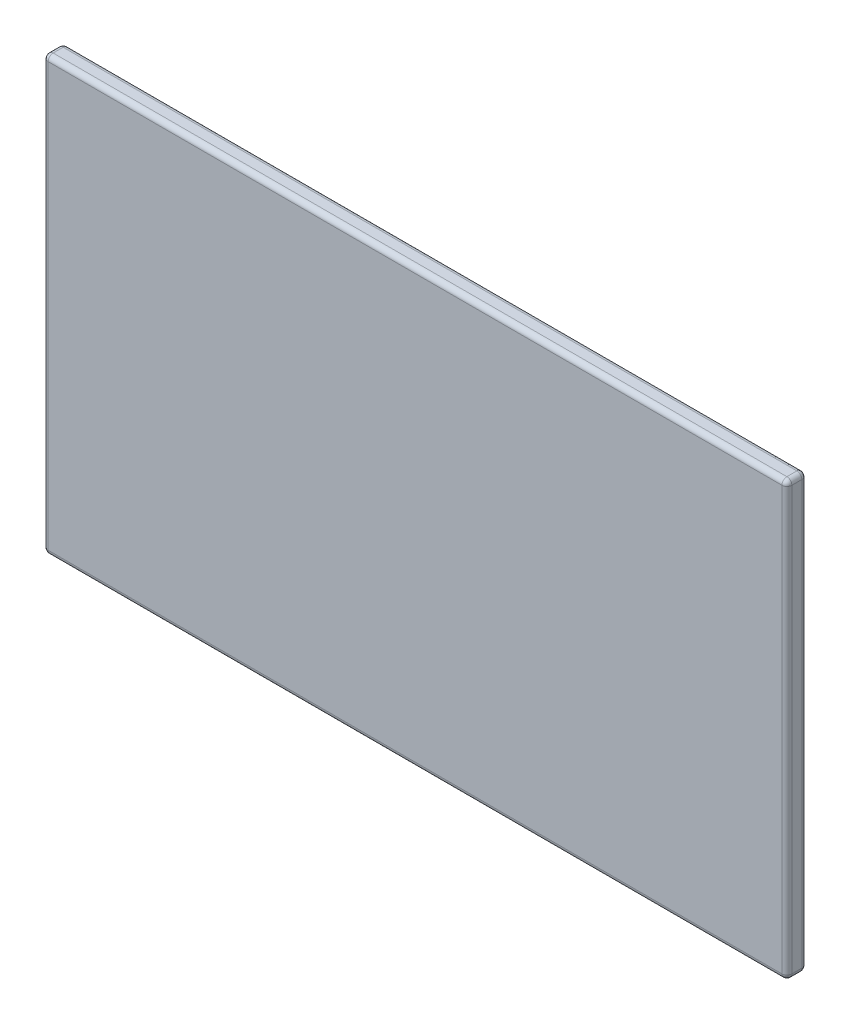
ISO-10303-21;
HEADER;
FILE_DESCRIPTION(('STEP AP214'),'2;1');
FILE_NAME('part.step','',(''),(''),'','','');
FILE_SCHEMA(('AUTOMOTIVE_DESIGN { 1 0 10303 214 1 1 1 1 }'));
ENDSEC;
DATA;
#1=APPLICATION_CONTEXT('core data for automotive mechanical design processes');
#2=APPLICATION_PROTOCOL_DEFINITION('international standard','automotive_design',2000,#1);
#3=PRODUCT_CONTEXT('',#1,'mechanical');
#4=PRODUCT('Part','Part','',(#3));
#5=PRODUCT_RELATED_PRODUCT_CATEGORY('part','',(#4));
#6=PRODUCT_DEFINITION_FORMATION('','',#4);
#7=PRODUCT_DEFINITION_CONTEXT('part definition',#1,'design');
#8=PRODUCT_DEFINITION('design','',#6,#7);
#9=PRODUCT_DEFINITION_SHAPE('','',#8);
#10=(LENGTH_UNIT() NAMED_UNIT(*) SI_UNIT(.MILLI.,.METRE.));
#11=(NAMED_UNIT(*) PLANE_ANGLE_UNIT() SI_UNIT($,.RADIAN.));
#12=(NAMED_UNIT(*) SI_UNIT($,.STERADIAN.) SOLID_ANGLE_UNIT());
#13=UNCERTAINTY_MEASURE_WITH_UNIT(LENGTH_MEASURE(1.E-05),#10,'distance_accuracy_value','');
#14=(GEOMETRIC_REPRESENTATION_CONTEXT(3) GLOBAL_UNCERTAINTY_ASSIGNED_CONTEXT((#13)) GLOBAL_UNIT_ASSIGNED_CONTEXT((#10,
#11,#12)) REPRESENTATION_CONTEXT('',''));
#15=CARTESIAN_POINT('',(0.,0.,0.));
#16=DIRECTION('',(0.,0.,1.));
#17=DIRECTION('',(1.,0.,0.));
#18=AXIS2_PLACEMENT_3D('',#15,#16,#17);
#19=CARTESIAN_POINT('',(37.35,-21.75,2.));
#20=DIRECTION('',(-1.,0.,0.));
#21=DIRECTION('',(0.,0.,1.));
#22=AXIS2_PLACEMENT_3D('',#19,#20,#21);
#23=PLANE('',#22);
#24=DIRECTION('',(0.,1.,0.));
#25=VECTOR('',#24,1.);
#26=CARTESIAN_POINT('',(37.35,-21.75,1.5));
#27=LINE('',#26,#25);
#28=CARTESIAN_POINT('',(37.35,21.25,1.5));
#29=VERTEX_POINT('',#28);
#30=CARTESIAN_POINT('',(37.35,-21.25,1.5));
#31=VERTEX_POINT('',#30);
#32=EDGE_CURVE('E42',#29,#31,#27,.F.);
#33=ORIENTED_EDGE('',*,*,#32,.T.);
#34=DIRECTION('',(0.,0.,-1.));
#35=VECTOR('',#34,1.);
#36=CARTESIAN_POINT('',(37.35,-21.25,2.));
#37=LINE('',#36,#35);
#38=CARTESIAN_POINT('',(37.35,-21.25,0.5));
#39=VERTEX_POINT('',#38);
#40=EDGE_CURVE('E11',#31,#39,#37,.T.);
#41=ORIENTED_EDGE('',*,*,#40,.T.);
#42=DIRECTION('',(0.,1.,0.));
#43=VECTOR('',#42,1.);
#44=CARTESIAN_POINT('',(37.35,21.75,0.5));
#45=LINE('',#44,#43);
#46=CARTESIAN_POINT('',(37.35,21.25,0.5));
#47=VERTEX_POINT('',#46);
#48=EDGE_CURVE('E194',#39,#47,#45,.T.);
#49=ORIENTED_EDGE('',*,*,#48,.T.);
#50=DIRECTION('',(0.,0.,-1.));
#51=VECTOR('',#50,1.);
#52=CARTESIAN_POINT('',(37.35,21.25,2.));
#53=LINE('',#52,#51);
#54=EDGE_CURVE('E53',#47,#29,#53,.F.);
#55=ORIENTED_EDGE('',*,*,#54,.T.);
#56=EDGE_LOOP('',(#33,#41,#49,#55));
#57=FACE_BOUND('',#56,.T.);
#58=ADVANCED_FACE('F33',(#57),#23,.F.);
#59=CARTESIAN_POINT('',(-37.35,21.75,2.));
#60=DIRECTION('',(0.,-1.,0.));
#61=DIRECTION('',(0.,0.,-1.));
#62=AXIS2_PLACEMENT_3D('',#59,#60,#61);
#63=PLANE('',#62);
#64=DIRECTION('',(0.,0.,-1.));
#65=VECTOR('',#64,1.);
#66=CARTESIAN_POINT('',(-36.85,21.75,2.));
#67=LINE('',#66,#65);
#68=CARTESIAN_POINT('',(-36.85,21.75,0.5));
#69=VERTEX_POINT('',#68);
#70=CARTESIAN_POINT('',(-36.85,21.75,1.5));
#71=VERTEX_POINT('',#70);
#72=EDGE_CURVE('E189',#69,#71,#67,.F.);
#73=ORIENTED_EDGE('',*,*,#72,.T.);
#74=DIRECTION('',(-1.,0.,0.));
#75=VECTOR('',#74,1.);
#76=CARTESIAN_POINT('',(-37.35,21.75,1.5));
#77=LINE('',#76,#75);
#78=CARTESIAN_POINT('',(36.85,21.75,1.5));
#79=VERTEX_POINT('',#78);
#80=EDGE_CURVE('E191',#71,#79,#77,.F.);
#81=ORIENTED_EDGE('',*,*,#80,.T.);
#82=DIRECTION('',(0.,0.,-1.));
#83=VECTOR('',#82,1.);
#84=CARTESIAN_POINT('',(36.85,21.75,2.));
#85=LINE('',#84,#83);
#86=CARTESIAN_POINT('',(36.85,21.75,0.5));
#87=VERTEX_POINT('',#86);
#88=EDGE_CURVE('E185',#79,#87,#85,.T.);
#89=ORIENTED_EDGE('',*,*,#88,.T.);
#90=DIRECTION('',(-1.,0.,0.));
#91=VECTOR('',#90,1.);
#92=CARTESIAN_POINT('',(-37.35,21.75,0.5));
#93=LINE('',#92,#91);
#94=EDGE_CURVE('E187',#87,#69,#93,.T.);
#95=ORIENTED_EDGE('',*,*,#94,.T.);
#96=EDGE_LOOP('',(#73,#81,#89,#95));
#97=FACE_BOUND('',#96,.T.);
#98=ADVANCED_FACE('F278',(#97),#63,.F.);
#99=CARTESIAN_POINT('',(-37.35,-21.75,2.));
#100=DIRECTION('',(1.,0.,0.));
#101=DIRECTION('',(0.,0.,-1.));
#102=AXIS2_PLACEMENT_3D('',#99,#100,#101);
#103=PLANE('',#102);
#104=DIRECTION('',(0.,0.,-1.));
#105=VECTOR('',#104,1.);
#106=CARTESIAN_POINT('',(-37.35,-21.25,2.));
#107=LINE('',#106,#105);
#108=CARTESIAN_POINT('',(-37.35,-21.25,0.5));
#109=VERTEX_POINT('',#108);
#110=CARTESIAN_POINT('',(-37.35,-21.25,1.5));
#111=VERTEX_POINT('',#110);
#112=EDGE_CURVE('E180',#109,#111,#107,.F.);
#113=ORIENTED_EDGE('',*,*,#112,.T.);
#114=DIRECTION('',(0.,-1.,0.));
#115=VECTOR('',#114,1.);
#116=CARTESIAN_POINT('',(-37.35,-21.75,1.5));
#117=LINE('',#116,#115);
#118=CARTESIAN_POINT('',(-37.35,21.25,1.5));
#119=VERTEX_POINT('',#118);
#120=EDGE_CURVE('E182',#111,#119,#117,.F.);
#121=ORIENTED_EDGE('',*,*,#120,.T.);
#122=DIRECTION('',(0.,0.,-1.));
#123=VECTOR('',#122,1.);
#124=CARTESIAN_POINT('',(-37.35,21.25,2.));
#125=LINE('',#124,#123);
#126=CARTESIAN_POINT('',(-37.35,21.25,0.5));
#127=VERTEX_POINT('',#126);
#128=EDGE_CURVE('E176',#119,#127,#125,.T.);
#129=ORIENTED_EDGE('',*,*,#128,.T.);
#130=DIRECTION('',(0.,-1.,0.));
#131=VECTOR('',#130,1.);
#132=CARTESIAN_POINT('',(-37.35,-21.75,0.5));
#133=LINE('',#132,#131);
#134=EDGE_CURVE('E178',#127,#109,#133,.T.);
#135=ORIENTED_EDGE('',*,*,#134,.T.);
#136=EDGE_LOOP('',(#113,#121,#129,#135));
#137=FACE_BOUND('',#136,.T.);
#138=ADVANCED_FACE('F269',(#137),#103,.F.);
#139=CARTESIAN_POINT('',(-37.35,-21.75,2.));
#140=DIRECTION('',(0.,1.,0.));
#141=DIRECTION('',(0.,0.,1.));
#142=AXIS2_PLACEMENT_3D('',#139,#140,#141);
#143=PLANE('',#142);
#144=DIRECTION('',(1.,0.,0.));
#145=VECTOR('',#144,1.);
#146=CARTESIAN_POINT('',(-37.35,-21.75,1.5));
#147=LINE('',#146,#145);
#148=CARTESIAN_POINT('',(36.85,-21.75,1.5));
#149=VERTEX_POINT('',#148);
#150=CARTESIAN_POINT('',(-36.85,-21.75,1.5));
#151=VERTEX_POINT('',#150);
#152=EDGE_CURVE('E129',#149,#151,#147,.F.);
#153=ORIENTED_EDGE('',*,*,#152,.T.);
#154=DIRECTION('',(0.,0.,-1.));
#155=VECTOR('',#154,1.);
#156=CARTESIAN_POINT('',(-36.85,-21.75,2.));
#157=LINE('',#156,#155);
#158=CARTESIAN_POINT('',(-36.85,-21.75,0.5));
#159=VERTEX_POINT('',#158);
#160=EDGE_CURVE('E165',#151,#159,#157,.T.);
#161=ORIENTED_EDGE('',*,*,#160,.T.);
#162=DIRECTION('',(1.,0.,0.));
#163=VECTOR('',#162,1.);
#164=CARTESIAN_POINT('',(37.35,-21.75,0.5));
#165=LINE('',#164,#163);
#166=CARTESIAN_POINT('',(36.85,-21.75,0.5));
#167=VERTEX_POINT('',#166);
#168=EDGE_CURVE('E158',#159,#167,#165,.T.);
#169=ORIENTED_EDGE('',*,*,#168,.T.);
#170=DIRECTION('',(0.,0.,-1.));
#171=VECTOR('',#170,1.);
#172=CARTESIAN_POINT('',(36.85,-21.75,2.));
#173=LINE('',#172,#171);
#174=EDGE_CURVE('E156',#167,#149,#173,.F.);
#175=ORIENTED_EDGE('',*,*,#174,.T.);
#176=EDGE_LOOP('',(#153,#161,#169,#175));
#177=FACE_BOUND('',#176,.T.);
#178=ADVANCED_FACE('F356',(#177),#143,.F.);
#179=CARTESIAN_POINT('',(0.,0.,2.));
#180=DIRECTION('',(0.,0.,-1.));
#181=DIRECTION('',(-1.,0.,0.));
#182=AXIS2_PLACEMENT_3D('',#179,#180,#181);
#183=PLANE('',#182);
#184=DIRECTION('',(0.,-1.,0.));
#185=VECTOR('',#184,1.);
#186=CARTESIAN_POINT('',(-36.85,0.,2.));
#187=LINE('',#186,#185);
#188=CARTESIAN_POINT('',(-36.85,21.25,2.));
#189=VERTEX_POINT('',#188);
#190=CARTESIAN_POINT('',(-36.85,-21.25,2.));
#191=VERTEX_POINT('',#190);
#192=EDGE_CURVE('E154',#189,#191,#187,.T.);
#193=ORIENTED_EDGE('',*,*,#192,.T.);
#194=DIRECTION('',(1.,0.,0.));
#195=VECTOR('',#194,1.);
#196=CARTESIAN_POINT('',(0.,-21.25,2.));
#197=LINE('',#196,#195);
#198=CARTESIAN_POINT('',(36.85,-21.25,2.));
#199=VERTEX_POINT('',#198);
#200=EDGE_CURVE('E127',#191,#199,#197,.T.);
#201=ORIENTED_EDGE('',*,*,#200,.T.);
#202=DIRECTION('',(0.,1.,0.));
#203=VECTOR('',#202,1.);
#204=CARTESIAN_POINT('',(36.85,0.,2.));
#205=LINE('',#204,#203);
#206=CARTESIAN_POINT('',(36.85,21.25,2.));
#207=VERTEX_POINT('',#206);
#208=EDGE_CURVE('E144',#199,#207,#205,.T.);
#209=ORIENTED_EDGE('',*,*,#208,.T.);
#210=DIRECTION('',(-1.,0.,0.));
#211=VECTOR('',#210,1.);
#212=CARTESIAN_POINT('',(0.,21.25,2.));
#213=LINE('',#212,#211);
#214=EDGE_CURVE('E150',#207,#189,#213,.T.);
#215=ORIENTED_EDGE('',*,*,#214,.T.);
#216=EDGE_LOOP('',(#193,#201,#209,#215));
#217=FACE_BOUND('',#216,.T.);
#218=ADVANCED_FACE('F152',(#217),#183,.F.);
#219=CARTESIAN_POINT('',(0.,0.,0.));
#220=DIRECTION('',(0.,0.,-1.));
#221=DIRECTION('',(-1.,0.,0.));
#222=AXIS2_PLACEMENT_3D('',#219,#220,#221);
#223=PLANE('',#222);
#224=DIRECTION('',(0.,1.,0.));
#225=VECTOR('',#224,1.);
#226=CARTESIAN_POINT('',(36.85,-21.75,0.));
#227=LINE('',#226,#225);
#228=CARTESIAN_POINT('',(36.85,21.25,0.));
#229=VERTEX_POINT('',#228);
#230=CARTESIAN_POINT('',(36.85,-21.25,0.));
#231=VERTEX_POINT('',#230);
#232=EDGE_CURVE('E167',#229,#231,#227,.F.);
#233=ORIENTED_EDGE('',*,*,#232,.T.);
#234=DIRECTION('',(1.,0.,0.));
#235=VECTOR('',#234,1.);
#236=CARTESIAN_POINT('',(-37.35,-21.25,0.));
#237=LINE('',#236,#235);
#238=CARTESIAN_POINT('',(-36.85,-21.25,0.));
#239=VERTEX_POINT('',#238);
#240=EDGE_CURVE('E173',#231,#239,#237,.F.);
#241=ORIENTED_EDGE('',*,*,#240,.T.);
#242=DIRECTION('',(0.,-1.,0.));
#243=VECTOR('',#242,1.);
#244=CARTESIAN_POINT('',(-36.85,21.75,0.));
#245=LINE('',#244,#243);
#246=CARTESIAN_POINT('',(-36.85,21.25,0.));
#247=VERTEX_POINT('',#246);
#248=EDGE_CURVE('E171',#239,#247,#245,.F.);
#249=ORIENTED_EDGE('',*,*,#248,.T.);
#250=DIRECTION('',(-1.,0.,0.));
#251=VECTOR('',#250,1.);
#252=CARTESIAN_POINT('',(37.35,21.25,0.));
#253=LINE('',#252,#251);
#254=EDGE_CURVE('E169',#247,#229,#253,.F.);
#255=ORIENTED_EDGE('',*,*,#254,.T.);
#256=EDGE_LOOP('',(#233,#241,#249,#255));
#257=FACE_BOUND('',#256,.T.);
#258=ADVANCED_FACE('F296',(#257),#223,.T.);
#259=CARTESIAN_POINT('',(-37.35,21.25,0.5));
#260=DIRECTION('',(1.,0.,0.));
#261=DIRECTION('',(0.,0.,-1.));
#262=AXIS2_PLACEMENT_3D('',#259,#260,#261);
#263=CYLINDRICAL_SURFACE('',#262,0.5);
#264=CARTESIAN_POINT('',(-36.85,21.25,0.5));
#265=DIRECTION('',(-1.,0.,0.));
#266=DIRECTION('',(0.,0.,1.));
#267=AXIS2_PLACEMENT_3D('',#264,#265,#266);
#268=CIRCLE('',#267,0.5);
#269=EDGE_CURVE('E37',#69,#247,#268,.T.);
#270=ORIENTED_EDGE('',*,*,#269,.F.);
#271=ORIENTED_EDGE('',*,*,#94,.F.);
#272=CARTESIAN_POINT('',(36.85,21.25,0.5));
#273=DIRECTION('',(1.,0.,0.));
#274=DIRECTION('',(0.,0.,-1.));
#275=AXIS2_PLACEMENT_3D('',#272,#273,#274);
#276=CIRCLE('',#275,0.5);
#277=EDGE_CURVE('E246',#229,#87,#276,.T.);
#278=ORIENTED_EDGE('',*,*,#277,.F.);
#279=ORIENTED_EDGE('',*,*,#254,.F.);
#280=EDGE_LOOP('',(#270,#271,#278,#279));
#281=FACE_BOUND('',#280,.T.);
#282=ADVANCED_FACE('F35',(#281),#263,.T.);
#283=CARTESIAN_POINT('',(-36.85,21.25,0.5));
#284=DIRECTION('',(0.,0.,1.));
#285=DIRECTION('',(1.,0.,0.));
#286=AXIS2_PLACEMENT_3D('',#283,#284,#285);
#287=SPHERICAL_SURFACE('',#286,0.5);
#288=CARTESIAN_POINT('',(-36.85,21.25,0.5));
#289=DIRECTION('',(0.,0.,-1.));
#290=DIRECTION('',(-1.,0.,0.));
#291=AXIS2_PLACEMENT_3D('',#288,#289,#290);
#292=CIRCLE('',#291,0.5);
#293=EDGE_CURVE('E241',#69,#127,#292,.F.);
#294=ORIENTED_EDGE('',*,*,#293,.F.);
#295=ORIENTED_EDGE('',*,*,#269,.T.);
#296=CARTESIAN_POINT('',(-36.85,21.25,0.5));
#297=DIRECTION('',(0.,1.,0.));
#298=DIRECTION('',(0.,0.,1.));
#299=AXIS2_PLACEMENT_3D('',#296,#297,#298);
#300=CIRCLE('',#299,0.5);
#301=EDGE_CURVE('E244',#127,#247,#300,.F.);
#302=ORIENTED_EDGE('',*,*,#301,.F.);
#303=EDGE_LOOP('',(#294,#295,#302));
#304=FACE_BOUND('',#303,.T.);
#305=ADVANCED_FACE('F257',(#304),#287,.T.);
#306=CARTESIAN_POINT('',(36.85,21.25,0.5));
#307=DIRECTION('',(0.,0.,1.));
#308=DIRECTION('',(1.,0.,0.));
#309=AXIS2_PLACEMENT_3D('',#306,#307,#308);
#310=SPHERICAL_SURFACE('',#309,0.5);
#311=CARTESIAN_POINT('',(36.85,21.25,0.5));
#312=DIRECTION('',(0.,1.,0.));
#313=DIRECTION('',(0.,0.,1.));
#314=AXIS2_PLACEMENT_3D('',#311,#312,#313);
#315=CIRCLE('',#314,0.5);
#316=EDGE_CURVE('E235',#229,#47,#315,.F.);
#317=ORIENTED_EDGE('',*,*,#316,.F.);
#318=ORIENTED_EDGE('',*,*,#277,.T.);
#319=CARTESIAN_POINT('',(36.85,21.25,0.5));
#320=DIRECTION('',(0.,0.,-1.));
#321=DIRECTION('',(-1.,0.,0.));
#322=AXIS2_PLACEMENT_3D('',#319,#320,#321);
#323=CIRCLE('',#322,0.5);
#324=EDGE_CURVE('E238',#47,#87,#323,.F.);
#325=ORIENTED_EDGE('',*,*,#324,.F.);
#326=EDGE_LOOP('',(#317,#318,#325));
#327=FACE_BOUND('',#326,.T.);
#328=ADVANCED_FACE('F289',(#327),#310,.T.);
#329=CARTESIAN_POINT('',(-36.85,-21.75,0.5));
#330=DIRECTION('',(0.,1.,0.));
#331=DIRECTION('',(0.,0.,1.));
#332=AXIS2_PLACEMENT_3D('',#329,#330,#331);
#333=CYLINDRICAL_SURFACE('',#332,0.5);
#334=ORIENTED_EDGE('',*,*,#301,.T.);
#335=ORIENTED_EDGE('',*,*,#248,.F.);
#336=CARTESIAN_POINT('',(-36.85,-21.25,0.5));
#337=DIRECTION('',(0.,-1.,0.));
#338=DIRECTION('',(0.,0.,-1.));
#339=AXIS2_PLACEMENT_3D('',#336,#337,#338);
#340=CIRCLE('',#339,0.5);
#341=EDGE_CURVE('E230',#109,#239,#340,.T.);
#342=ORIENTED_EDGE('',*,*,#341,.F.);
#343=ORIENTED_EDGE('',*,*,#134,.F.);
#344=EDGE_LOOP('',(#334,#335,#342,#343));
#345=FACE_BOUND('',#344,.T.);
#346=ADVANCED_FACE('F265',(#345),#333,.T.);
#347=CARTESIAN_POINT('',(-36.85,21.25,2.));
#348=DIRECTION('',(0.,0.,-1.));
#349=DIRECTION('',(-1.,0.,0.));
#350=AXIS2_PLACEMENT_3D('',#347,#348,#349);
#351=CYLINDRICAL_SURFACE('',#350,0.5);
#352=ORIENTED_EDGE('',*,*,#293,.T.);
#353=ORIENTED_EDGE('',*,*,#128,.F.);
#354=CARTESIAN_POINT('',(-36.85,21.25,1.5));
#355=DIRECTION('',(0.,0.,1.));
#356=DIRECTION('',(1.,0.,0.));
#357=AXIS2_PLACEMENT_3D('',#354,#355,#356);
#358=CIRCLE('',#357,0.5);
#359=EDGE_CURVE('E227',#71,#119,#358,.T.);
#360=ORIENTED_EDGE('',*,*,#359,.F.);
#361=ORIENTED_EDGE('',*,*,#72,.F.);
#362=EDGE_LOOP('',(#352,#353,#360,#361));
#363=FACE_BOUND('',#362,.T.);
#364=ADVANCED_FACE('F275',(#363),#351,.T.);
#365=CARTESIAN_POINT('',(0.,21.25,1.5));
#366=DIRECTION('',(-1.,0.,0.));
#367=DIRECTION('',(0.,0.,1.));
#368=AXIS2_PLACEMENT_3D('',#365,#366,#367);
#369=CYLINDRICAL_SURFACE('',#368,0.5);
#370=CARTESIAN_POINT('',(36.85,21.25,1.5));
#371=DIRECTION('',(1.,0.,0.));
#372=DIRECTION('',(0.,0.,-1.));
#373=AXIS2_PLACEMENT_3D('',#370,#371,#372);
#374=CIRCLE('',#373,0.5);
#375=EDGE_CURVE('E221',#79,#207,#374,.T.);
#376=ORIENTED_EDGE('',*,*,#375,.F.);
#377=ORIENTED_EDGE('',*,*,#80,.F.);
#378=CARTESIAN_POINT('',(-36.85,21.25,1.5));
#379=DIRECTION('',(-1.,0.,0.));
#380=DIRECTION('',(0.,0.,1.));
#381=AXIS2_PLACEMENT_3D('',#378,#379,#380);
#382=CIRCLE('',#381,0.5);
#383=EDGE_CURVE('E224',#189,#71,#382,.T.);
#384=ORIENTED_EDGE('',*,*,#383,.F.);
#385=ORIENTED_EDGE('',*,*,#214,.F.);
#386=EDGE_LOOP('',(#376,#377,#384,#385));
#387=FACE_BOUND('',#386,.T.);
#388=ADVANCED_FACE('F282',(#387),#369,.T.);
#389=CARTESIAN_POINT('',(36.85,21.25,2.));
#390=DIRECTION('',(0.,0.,-1.));
#391=DIRECTION('',(-1.,0.,0.));
#392=AXIS2_PLACEMENT_3D('',#389,#390,#391);
#393=CYLINDRICAL_SURFACE('',#392,0.5);
#394=ORIENTED_EDGE('',*,*,#324,.T.);
#395=ORIENTED_EDGE('',*,*,#88,.F.);
#396=CARTESIAN_POINT('',(36.85,21.25,1.5));
#397=DIRECTION('',(0.,0.,1.));
#398=DIRECTION('',(1.,0.,0.));
#399=AXIS2_PLACEMENT_3D('',#396,#397,#398);
#400=CIRCLE('',#399,0.5);
#401=EDGE_CURVE('E219',#29,#79,#400,.T.);
#402=ORIENTED_EDGE('',*,*,#401,.F.);
#403=ORIENTED_EDGE('',*,*,#54,.F.);
#404=EDGE_LOOP('',(#394,#395,#402,#403));
#405=FACE_BOUND('',#404,.T.);
#406=ADVANCED_FACE('F287',(#405),#393,.T.);
#407=CARTESIAN_POINT('',(36.85,-21.75,0.5));
#408=DIRECTION('',(0.,-1.,0.));
#409=DIRECTION('',(0.,0.,-1.));
#410=AXIS2_PLACEMENT_3D('',#407,#408,#409);
#411=CYLINDRICAL_SURFACE('',#410,0.5);
#412=ORIENTED_EDGE('',*,*,#316,.T.);
#413=ORIENTED_EDGE('',*,*,#48,.F.);
#414=CARTESIAN_POINT('',(36.85,-21.25,0.5));
#415=DIRECTION('',(0.,-1.,0.));
#416=DIRECTION('',(0.,0.,-1.));
#417=AXIS2_PLACEMENT_3D('',#414,#415,#416);
#418=CIRCLE('',#417,0.5);
#419=EDGE_CURVE('E216',#231,#39,#418,.T.);
#420=ORIENTED_EDGE('',*,*,#419,.F.);
#421=ORIENTED_EDGE('',*,*,#232,.F.);
#422=EDGE_LOOP('',(#412,#413,#420,#421));
#423=FACE_BOUND('',#422,.T.);
#424=ADVANCED_FACE('F293',(#423),#411,.T.);
#425=CARTESIAN_POINT('',(-37.35,-21.25,0.5));
#426=DIRECTION('',(-1.,0.,0.));
#427=DIRECTION('',(0.,0.,1.));
#428=AXIS2_PLACEMENT_3D('',#425,#426,#427);
#429=CYLINDRICAL_SURFACE('',#428,0.5);
#430=CARTESIAN_POINT('',(-36.85,-21.25,0.5));
#431=DIRECTION('',(-1.,0.,0.));
#432=DIRECTION('',(0.,0.,1.));
#433=AXIS2_PLACEMENT_3D('',#430,#431,#432);
#434=CIRCLE('',#433,0.5);
#435=EDGE_CURVE('E232',#239,#159,#434,.T.);
#436=ORIENTED_EDGE('',*,*,#435,.F.);
#437=ORIENTED_EDGE('',*,*,#240,.F.);
#438=CARTESIAN_POINT('',(36.85,-21.25,0.5));
#439=DIRECTION('',(1.,0.,0.));
#440=DIRECTION('',(0.,0.,-1.));
#441=AXIS2_PLACEMENT_3D('',#438,#439,#440);
#442=CIRCLE('',#441,0.5);
#443=EDGE_CURVE('E213',#167,#231,#442,.T.);
#444=ORIENTED_EDGE('',*,*,#443,.F.);
#445=ORIENTED_EDGE('',*,*,#168,.F.);
#446=EDGE_LOOP('',(#436,#437,#444,#445));
#447=FACE_BOUND('',#446,.T.);
#448=ADVANCED_FACE('F300',(#447),#429,.T.);
#449=CARTESIAN_POINT('',(-36.85,-21.25,0.5));
#450=DIRECTION('',(0.,0.,1.));
#451=DIRECTION('',(1.,0.,0.));
#452=AXIS2_PLACEMENT_3D('',#449,#450,#451);
#453=SPHERICAL_SURFACE('',#452,0.5);
#454=ORIENTED_EDGE('',*,*,#341,.T.);
#455=ORIENTED_EDGE('',*,*,#435,.T.);
#456=CARTESIAN_POINT('',(-36.85,-21.25,0.5));
#457=DIRECTION('',(0.,0.,-1.));
#458=DIRECTION('',(-1.,0.,0.));
#459=AXIS2_PLACEMENT_3D('',#456,#457,#458);
#460=CIRCLE('',#459,0.5);
#461=EDGE_CURVE('E210',#109,#159,#460,.F.);
#462=ORIENTED_EDGE('',*,*,#461,.F.);
#463=EDGE_LOOP('',(#454,#455,#462));
#464=FACE_BOUND('',#463,.T.);
#465=ADVANCED_FACE('F304',(#464),#453,.T.);
#466=CARTESIAN_POINT('',(-36.85,21.25,1.5));
#467=DIRECTION('',(0.,0.,1.));
#468=DIRECTION('',(1.,0.,0.));
#469=AXIS2_PLACEMENT_3D('',#466,#467,#468);
#470=SPHERICAL_SURFACE('',#469,0.5);
#471=ORIENTED_EDGE('',*,*,#383,.T.);
#472=ORIENTED_EDGE('',*,*,#359,.T.);
#473=CARTESIAN_POINT('',(-36.85,21.25,1.5));
#474=DIRECTION('',(0.,1.,0.));
#475=DIRECTION('',(0.,0.,1.));
#476=AXIS2_PLACEMENT_3D('',#473,#474,#475);
#477=CIRCLE('',#476,0.5);
#478=EDGE_CURVE('E208',#189,#119,#477,.F.);
#479=ORIENTED_EDGE('',*,*,#478,.F.);
#480=EDGE_LOOP('',(#471,#472,#479));
#481=FACE_BOUND('',#480,.T.);
#482=ADVANCED_FACE('F315',(#481),#470,.T.);
#483=CARTESIAN_POINT('',(36.85,21.25,1.5));
#484=DIRECTION('',(0.,0.,1.));
#485=DIRECTION('',(1.,0.,0.));
#486=AXIS2_PLACEMENT_3D('',#483,#484,#485);
#487=SPHERICAL_SURFACE('',#486,0.5);
#488=ORIENTED_EDGE('',*,*,#401,.T.);
#489=ORIENTED_EDGE('',*,*,#375,.T.);
#490=CARTESIAN_POINT('',(36.85,21.25,1.5));
#491=DIRECTION('',(0.,1.,0.));
#492=DIRECTION('',(0.,0.,1.));
#493=AXIS2_PLACEMENT_3D('',#490,#491,#492);
#494=CIRCLE('',#493,0.5);
#495=EDGE_CURVE('E147',#29,#207,#494,.F.);
#496=ORIENTED_EDGE('',*,*,#495,.F.);
#497=EDGE_LOOP('',(#488,#489,#496));
#498=FACE_BOUND('',#497,.T.);
#499=ADVANCED_FACE('F317',(#498),#487,.T.);
#500=CARTESIAN_POINT('',(36.85,-21.25,0.5));
#501=DIRECTION('',(0.,0.,1.));
#502=DIRECTION('',(1.,0.,0.));
#503=AXIS2_PLACEMENT_3D('',#500,#501,#502);
#504=SPHERICAL_SURFACE('',#503,0.5);
#505=ORIENTED_EDGE('',*,*,#443,.T.);
#506=ORIENTED_EDGE('',*,*,#419,.T.);
#507=CARTESIAN_POINT('',(36.85,-21.25,0.5));
#508=DIRECTION('',(0.,0.,-1.));
#509=DIRECTION('',(-1.,0.,0.));
#510=AXIS2_PLACEMENT_3D('',#507,#508,#509);
#511=CIRCLE('',#510,0.5);
#512=EDGE_CURVE('E205',#167,#39,#511,.F.);
#513=ORIENTED_EDGE('',*,*,#512,.F.);
#514=EDGE_LOOP('',(#505,#506,#513));
#515=FACE_BOUND('',#514,.T.);
#516=ADVANCED_FACE('F323',(#515),#504,.T.);
#517=CARTESIAN_POINT('',(-36.85,-21.25,2.));
#518=DIRECTION('',(0.,0.,-1.));
#519=DIRECTION('',(-1.,0.,0.));
#520=AXIS2_PLACEMENT_3D('',#517,#518,#519);
#521=CYLINDRICAL_SURFACE('',#520,0.5);
#522=ORIENTED_EDGE('',*,*,#461,.T.);
#523=ORIENTED_EDGE('',*,*,#160,.F.);
#524=CARTESIAN_POINT('',(-36.85,-21.25,1.5));
#525=DIRECTION('',(0.,0.,1.));
#526=DIRECTION('',(1.,0.,0.));
#527=AXIS2_PLACEMENT_3D('',#524,#525,#526);
#528=CIRCLE('',#527,0.5);
#529=EDGE_CURVE('E202',#111,#151,#528,.T.);
#530=ORIENTED_EDGE('',*,*,#529,.F.);
#531=ORIENTED_EDGE('',*,*,#112,.F.);
#532=EDGE_LOOP('',(#522,#523,#530,#531));
#533=FACE_BOUND('',#532,.T.);
#534=ADVANCED_FACE('F307',(#533),#521,.T.);
#535=CARTESIAN_POINT('',(-36.85,0.,1.5));
#536=DIRECTION('',(0.,-1.,0.));
#537=DIRECTION('',(0.,0.,-1.));
#538=AXIS2_PLACEMENT_3D('',#535,#536,#537);
#539=CYLINDRICAL_SURFACE('',#538,0.5);
#540=ORIENTED_EDGE('',*,*,#478,.T.);
#541=ORIENTED_EDGE('',*,*,#120,.F.);
#542=CARTESIAN_POINT('',(-36.85,-21.25,1.5));
#543=DIRECTION('',(0.,-1.,0.));
#544=DIRECTION('',(0.,0.,-1.));
#545=AXIS2_PLACEMENT_3D('',#542,#543,#544);
#546=CIRCLE('',#545,0.5);
#547=EDGE_CURVE('E141',#191,#111,#546,.T.);
#548=ORIENTED_EDGE('',*,*,#547,.F.);
#549=ORIENTED_EDGE('',*,*,#192,.F.);
#550=EDGE_LOOP('',(#540,#541,#548,#549));
#551=FACE_BOUND('',#550,.T.);
#552=ADVANCED_FACE('F313',(#551),#539,.T.);
#553=CARTESIAN_POINT('',(36.85,0.,1.5));
#554=DIRECTION('',(0.,1.,0.));
#555=DIRECTION('',(0.,0.,1.));
#556=AXIS2_PLACEMENT_3D('',#553,#554,#555);
#557=CYLINDRICAL_SURFACE('',#556,0.5);
#558=ORIENTED_EDGE('',*,*,#495,.T.);
#559=ORIENTED_EDGE('',*,*,#208,.F.);
#560=CARTESIAN_POINT('',(36.85,-21.25,1.5));
#561=DIRECTION('',(0.,-1.,0.));
#562=DIRECTION('',(0.,0.,-1.));
#563=AXIS2_PLACEMENT_3D('',#560,#561,#562);
#564=CIRCLE('',#563,0.5);
#565=EDGE_CURVE('E135',#31,#199,#564,.T.);
#566=ORIENTED_EDGE('',*,*,#565,.F.);
#567=ORIENTED_EDGE('',*,*,#32,.F.);
#568=EDGE_LOOP('',(#558,#559,#566,#567));
#569=FACE_BOUND('',#568,.T.);
#570=ADVANCED_FACE('F145',(#569),#557,.T.);
#571=CARTESIAN_POINT('',(36.85,-21.25,2.));
#572=DIRECTION('',(0.,0.,-1.));
#573=DIRECTION('',(-1.,0.,0.));
#574=AXIS2_PLACEMENT_3D('',#571,#572,#573);
#575=CYLINDRICAL_SURFACE('',#574,0.5);
#576=ORIENTED_EDGE('',*,*,#512,.T.);
#577=ORIENTED_EDGE('',*,*,#40,.F.);
#578=CARTESIAN_POINT('',(36.85,-21.25,1.5));
#579=DIRECTION('',(0.,0.,1.));
#580=DIRECTION('',(1.,0.,0.));
#581=AXIS2_PLACEMENT_3D('',#578,#579,#580);
#582=CIRCLE('',#581,0.5);
#583=EDGE_CURVE('E139',#149,#31,#582,.T.);
#584=ORIENTED_EDGE('',*,*,#583,.F.);
#585=ORIENTED_EDGE('',*,*,#174,.F.);
#586=EDGE_LOOP('',(#576,#577,#584,#585));
#587=FACE_BOUND('',#586,.T.);
#588=ADVANCED_FACE('F340',(#587),#575,.T.);
#589=CARTESIAN_POINT('',(-36.85,-21.25,1.5));
#590=DIRECTION('',(0.,0.,1.));
#591=DIRECTION('',(1.,0.,0.));
#592=AXIS2_PLACEMENT_3D('',#589,#590,#591);
#593=SPHERICAL_SURFACE('',#592,0.5);
#594=ORIENTED_EDGE('',*,*,#547,.T.);
#595=ORIENTED_EDGE('',*,*,#529,.T.);
#596=CARTESIAN_POINT('',(-36.85,-21.25,1.5));
#597=DIRECTION('',(-1.,0.,0.));
#598=DIRECTION('',(0.,0.,1.));
#599=AXIS2_PLACEMENT_3D('',#596,#597,#598);
#600=CIRCLE('',#599,0.5);
#601=EDGE_CURVE('E132',#191,#151,#600,.F.);
#602=ORIENTED_EDGE('',*,*,#601,.F.);
#603=EDGE_LOOP('',(#594,#595,#602));
#604=FACE_BOUND('',#603,.T.);
#605=ADVANCED_FACE('F311',(#604),#593,.T.);
#606=CARTESIAN_POINT('',(36.85,-21.25,1.5));
#607=DIRECTION('',(0.,0.,1.));
#608=DIRECTION('',(1.,0.,0.));
#609=AXIS2_PLACEMENT_3D('',#606,#607,#608);
#610=SPHERICAL_SURFACE('',#609,0.5);
#611=ORIENTED_EDGE('',*,*,#583,.T.);
#612=ORIENTED_EDGE('',*,*,#565,.T.);
#613=CARTESIAN_POINT('',(36.85,-21.25,1.5));
#614=DIRECTION('',(1.,0.,0.));
#615=DIRECTION('',(0.,0.,-1.));
#616=AXIS2_PLACEMENT_3D('',#613,#614,#615);
#617=CIRCLE('',#616,0.5);
#618=EDGE_CURVE('E123',#149,#199,#617,.F.);
#619=ORIENTED_EDGE('',*,*,#618,.F.);
#620=EDGE_LOOP('',(#611,#612,#619));
#621=FACE_BOUND('',#620,.T.);
#622=ADVANCED_FACE('F137',(#621),#610,.T.);
#623=CARTESIAN_POINT('',(0.,-21.25,1.5));
#624=DIRECTION('',(1.,0.,0.));
#625=DIRECTION('',(0.,0.,-1.));
#626=AXIS2_PLACEMENT_3D('',#623,#624,#625);
#627=CYLINDRICAL_SURFACE('',#626,0.5);
#628=ORIENTED_EDGE('',*,*,#601,.T.);
#629=ORIENTED_EDGE('',*,*,#152,.F.);
#630=ORIENTED_EDGE('',*,*,#618,.T.);
#631=ORIENTED_EDGE('',*,*,#200,.F.);
#632=EDGE_LOOP('',(#628,#629,#630,#631));
#633=FACE_BOUND('',#632,.T.);
#634=ADVANCED_FACE('F125',(#633),#627,.T.);
#635=CLOSED_SHELL('',(#58,#98,#138,#178,#218,#258,#282,#305,#328,#346,#364,#388,#406,#424,#448,
#465,#482,#499,#516,#534,#552,#570,#588,#605,#622,#634));
#636=MANIFOLD_SOLID_BREP('B2',#635);
#637=ADVANCED_BREP_SHAPE_REPRESENTATION('',(#18,#636),#14);
#638=SHAPE_DEFINITION_REPRESENTATION(#9,#637);
ENDSEC;
END-ISO-10303-21;
